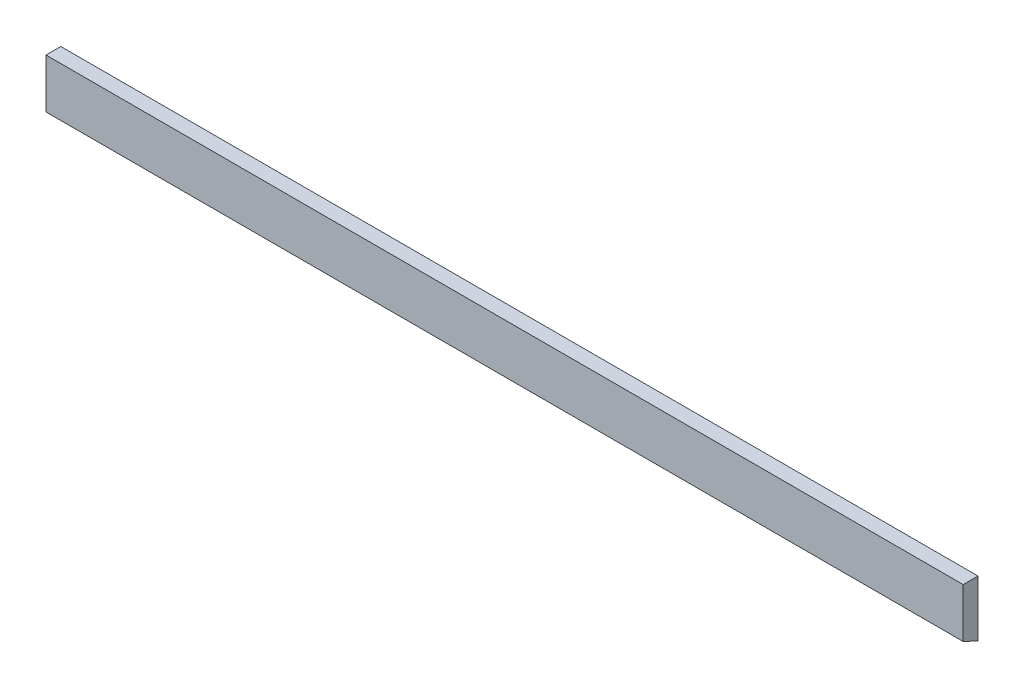
ISO-10303-21;
HEADER;
FILE_DESCRIPTION(('STEP AP214'),'2;1');
FILE_NAME('part.step','',(''),(''),'','','');
FILE_SCHEMA(('AUTOMOTIVE_DESIGN { 1 0 10303 214 1 1 1 1 }'));
ENDSEC;
DATA;
#1=APPLICATION_CONTEXT('core data for automotive mechanical design processes');
#2=APPLICATION_PROTOCOL_DEFINITION('international standard','automotive_design',2000,#1);
#3=PRODUCT_CONTEXT('',#1,'mechanical');
#4=PRODUCT('Part','Part','',(#3));
#5=PRODUCT_RELATED_PRODUCT_CATEGORY('part','',(#4));
#6=PRODUCT_DEFINITION_FORMATION('','',#4);
#7=PRODUCT_DEFINITION_CONTEXT('part definition',#1,'design');
#8=PRODUCT_DEFINITION('design','',#6,#7);
#9=PRODUCT_DEFINITION_SHAPE('','',#8);
#10=(LENGTH_UNIT() NAMED_UNIT(*) SI_UNIT(.MILLI.,.METRE.));
#11=(NAMED_UNIT(*) PLANE_ANGLE_UNIT() SI_UNIT($,.RADIAN.));
#12=(NAMED_UNIT(*) SI_UNIT($,.STERADIAN.) SOLID_ANGLE_UNIT());
#13=UNCERTAINTY_MEASURE_WITH_UNIT(LENGTH_MEASURE(1.E-05),#10,'distance_accuracy_value','');
#14=(GEOMETRIC_REPRESENTATION_CONTEXT(3) GLOBAL_UNCERTAINTY_ASSIGNED_CONTEXT((#13)) GLOBAL_UNIT_ASSIGNED_CONTEXT((#10,
#11,#12)) REPRESENTATION_CONTEXT('',''));
#15=CARTESIAN_POINT('',(0.,0.,0.));
#16=DIRECTION('',(0.,0.,1.));
#17=DIRECTION('',(1.,0.,0.));
#18=AXIS2_PLACEMENT_3D('',#15,#16,#17);
#19=CARTESIAN_POINT('',(0.,0.,3.));
#20=DIRECTION('',(-1.,0.,0.));
#21=DIRECTION('',(0.,-1.,0.));
#22=AXIS2_PLACEMENT_3D('',#19,#20,#21);
#23=PLANE('',#22);
#24=DIRECTION('',(0.,1.,0.));
#25=VECTOR('',#24,1.);
#26=CARTESIAN_POINT('',(0.,0.,0.));
#27=LINE('',#26,#25);
#28=CARTESIAN_POINT('',(0.,-1.39892297446496,0.));
#29=VERTEX_POINT('',#28);
#30=CARTESIAN_POINT('',(0.,10.,0.));
#31=VERTEX_POINT('',#30);
#32=EDGE_CURVE('E96',#29,#31,#27,.T.);
#33=ORIENTED_EDGE('',*,*,#32,.T.);
#34=DIRECTION('',(0.,0.,-1.));
#35=VECTOR('',#34,1.);
#36=CARTESIAN_POINT('',(0.,10.,3.));
#37=LINE('',#36,#35);
#38=CARTESIAN_POINT('',(0.,10.,3.));
#39=VERTEX_POINT('',#38);
#40=EDGE_CURVE('E11',#39,#31,#37,.T.);
#41=ORIENTED_EDGE('',*,*,#40,.F.);
#42=DIRECTION('',(0.,1.,0.));
#43=VECTOR('',#42,1.);
#44=CARTESIAN_POINT('',(0.,0.,3.));
#45=LINE('',#44,#43);
#46=CARTESIAN_POINT('',(0.,0.,3.));
#47=VERTEX_POINT('',#46);
#48=EDGE_CURVE('E84',#47,#39,#45,.T.);
#49=ORIENTED_EDGE('',*,*,#48,.F.);
#50=DIRECTION('',(0.,-0.42261826174069,-0.906307787036654));
#51=VECTOR('',#50,1.);
#52=CARTESIAN_POINT('',(0.,0.,3.));
#53=LINE('',#52,#51);
#54=EDGE_CURVE('E105',#47,#29,#53,.T.);
#55=ORIENTED_EDGE('',*,*,#54,.T.);
#56=EDGE_LOOP('',(#33,#41,#49,#55));
#57=FACE_BOUND('',#56,.T.);
#58=ADVANCED_FACE('F37',(#57),#23,.F.);
#59=CARTESIAN_POINT('',(0.,10.,3.));
#60=DIRECTION('',(0.,-1.,0.));
#61=DIRECTION('',(1.,0.,0.));
#62=AXIS2_PLACEMENT_3D('',#59,#60,#61);
#63=PLANE('',#62);
#64=DIRECTION('',(-1.,0.,0.));
#65=VECTOR('',#64,1.);
#66=CARTESIAN_POINT('',(0.,10.,0.));
#67=LINE('',#66,#65);
#68=CARTESIAN_POINT('',(-186.,9.99999999999998,0.));
#69=VERTEX_POINT('',#68);
#70=EDGE_CURVE('E65',#31,#69,#67,.T.);
#71=ORIENTED_EDGE('',*,*,#70,.T.);
#72=DIRECTION('',(0.,0.,-1.));
#73=VECTOR('',#72,1.);
#74=CARTESIAN_POINT('',(-186.,9.99999999999998,3.));
#75=LINE('',#74,#73);
#76=CARTESIAN_POINT('',(-186.,9.99999999999998,3.));
#77=VERTEX_POINT('',#76);
#78=EDGE_CURVE('E45',#77,#69,#75,.T.);
#79=ORIENTED_EDGE('',*,*,#78,.F.);
#80=DIRECTION('',(-1.,0.,0.));
#81=VECTOR('',#80,1.);
#82=CARTESIAN_POINT('',(0.,10.,3.));
#83=LINE('',#82,#81);
#84=EDGE_CURVE('E79',#39,#77,#83,.T.);
#85=ORIENTED_EDGE('',*,*,#84,.F.);
#86=ORIENTED_EDGE('',*,*,#40,.T.);
#87=EDGE_LOOP('',(#71,#79,#85,#86));
#88=FACE_BOUND('',#87,.T.);
#89=ADVANCED_FACE('F88',(#88),#63,.F.);
#90=CARTESIAN_POINT('',(-186.,0.,3.));
#91=DIRECTION('',(1.,0.,0.));
#92=DIRECTION('',(0.,0.,-1.));
#93=AXIS2_PLACEMENT_3D('',#90,#91,#92);
#94=PLANE('',#93);
#95=DIRECTION('',(0.,-1.,0.));
#96=VECTOR('',#95,1.);
#97=CARTESIAN_POINT('',(-186.,0.,0.));
#98=LINE('',#97,#96);
#99=CARTESIAN_POINT('',(-186.,-1.39892297446496,0.));
#100=VERTEX_POINT('',#99);
#101=EDGE_CURVE('E73',#69,#100,#98,.T.);
#102=ORIENTED_EDGE('',*,*,#101,.T.);
#103=DIRECTION('',(0.,0.42261826174069,0.906307787036654));
#104=VECTOR('',#103,1.);
#105=CARTESIAN_POINT('',(-186.,0.,3.));
#106=LINE('',#105,#104);
#107=CARTESIAN_POINT('',(-186.,0.,3.));
#108=VERTEX_POINT('',#107);
#109=EDGE_CURVE('E91',#100,#108,#106,.T.);
#110=ORIENTED_EDGE('',*,*,#109,.T.);
#111=DIRECTION('',(0.,-1.,0.));
#112=VECTOR('',#111,1.);
#113=CARTESIAN_POINT('',(-186.,0.,3.));
#114=LINE('',#113,#112);
#115=EDGE_CURVE('E83',#77,#108,#114,.T.);
#116=ORIENTED_EDGE('',*,*,#115,.F.);
#117=ORIENTED_EDGE('',*,*,#78,.T.);
#118=EDGE_LOOP('',(#102,#110,#116,#117));
#119=FACE_BOUND('',#118,.T.);
#120=ADVANCED_FACE('F89',(#119),#94,.F.);
#121=CARTESIAN_POINT('',(0.,0.,3.));
#122=DIRECTION('',(0.,0.,1.));
#123=DIRECTION('',(1.,0.,0.));
#124=AXIS2_PLACEMENT_3D('',#121,#122,#123);
#125=PLANE('',#124);
#126=ORIENTED_EDGE('',*,*,#48,.T.);
#127=ORIENTED_EDGE('',*,*,#84,.T.);
#128=ORIENTED_EDGE('',*,*,#115,.T.);
#129=DIRECTION('',(1.,0.,0.));
#130=VECTOR('',#129,1.);
#131=CARTESIAN_POINT('',(0.,0.,3.));
#132=LINE('',#131,#130);
#133=EDGE_CURVE('E53',#108,#47,#132,.T.);
#134=ORIENTED_EDGE('',*,*,#133,.T.);
#135=EDGE_LOOP('',(#126,#127,#128,#134));
#136=FACE_BOUND('',#135,.T.);
#137=ADVANCED_FACE('F81',(#136),#125,.T.);
#138=CARTESIAN_POINT('',(0.,0.,0.));
#139=DIRECTION('',(0.,0.,1.));
#140=DIRECTION('',(1.,0.,0.));
#141=AXIS2_PLACEMENT_3D('',#138,#139,#140);
#142=PLANE('',#141);
#143=ORIENTED_EDGE('',*,*,#32,.F.);
#144=DIRECTION('',(1.,0.,0.));
#145=VECTOR('',#144,1.);
#146=CARTESIAN_POINT('',(-189.310133756887,-1.39892297446496,0.));
#147=LINE('',#146,#145);
#148=EDGE_CURVE('E102',#100,#29,#147,.T.);
#149=ORIENTED_EDGE('',*,*,#148,.F.);
#150=ORIENTED_EDGE('',*,*,#101,.F.);
#151=ORIENTED_EDGE('',*,*,#70,.F.);
#152=EDGE_LOOP('',(#143,#149,#150,#151));
#153=FACE_BOUND('',#152,.T.);
#154=ADVANCED_FACE('F111',(#153),#142,.F.);
#155=CARTESIAN_POINT('',(-189.310133756887,0.,3.));
#156=DIRECTION('',(0.,-0.906307787036654,0.42261826174069));
#157=DIRECTION('',(0.,-0.42261826174069,-0.906307787036654));
#158=AXIS2_PLACEMENT_3D('',#155,#156,#157);
#159=PLANE('',#158);
#160=ORIENTED_EDGE('',*,*,#109,.F.);
#161=ORIENTED_EDGE('',*,*,#148,.T.);
#162=ORIENTED_EDGE('',*,*,#54,.F.);
#163=ORIENTED_EDGE('',*,*,#133,.F.);
#164=EDGE_LOOP('',(#160,#161,#162,#163));
#165=FACE_BOUND('',#164,.T.);
#166=ADVANCED_FACE('F110',(#165),#159,.T.);
#167=CLOSED_SHELL('',(#58,#89,#120,#137,#154,#166));
#168=MANIFOLD_SOLID_BREP('B2',#167);
#169=ADVANCED_BREP_SHAPE_REPRESENTATION('',(#18,#168),#14);
#170=SHAPE_DEFINITION_REPRESENTATION(#9,#169);
ENDSEC;
END-ISO-10303-21;
